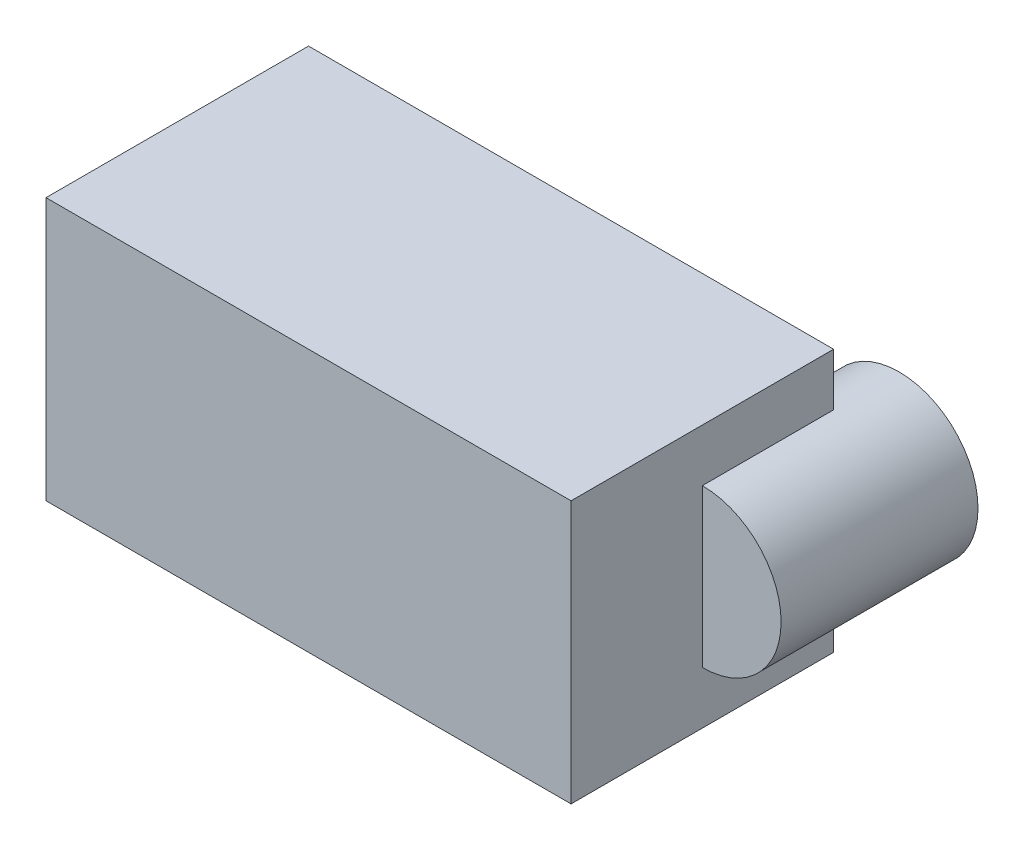
ISO-10303-21;
HEADER;
FILE_DESCRIPTION(('STEP AP214'),'2;1');
FILE_NAME('part.step','',(''),(''),'','','');
FILE_SCHEMA(('AUTOMOTIVE_DESIGN { 1 0 10303 214 1 1 1 1 }'));
ENDSEC;
DATA;
#1=APPLICATION_CONTEXT('core data for automotive mechanical design processes');
#2=APPLICATION_PROTOCOL_DEFINITION('international standard','automotive_design',2000,#1);
#3=PRODUCT_CONTEXT('',#1,'mechanical');
#4=PRODUCT('Part','Part','',(#3));
#5=PRODUCT_RELATED_PRODUCT_CATEGORY('part','',(#4));
#6=PRODUCT_DEFINITION_FORMATION('','',#4);
#7=PRODUCT_DEFINITION_CONTEXT('part definition',#1,'design');
#8=PRODUCT_DEFINITION('design','',#6,#7);
#9=PRODUCT_DEFINITION_SHAPE('','',#8);
#10=(LENGTH_UNIT() NAMED_UNIT(*) SI_UNIT(.MILLI.,.METRE.));
#11=(NAMED_UNIT(*) PLANE_ANGLE_UNIT() SI_UNIT($,.RADIAN.));
#12=(NAMED_UNIT(*) SI_UNIT($,.STERADIAN.) SOLID_ANGLE_UNIT());
#13=UNCERTAINTY_MEASURE_WITH_UNIT(LENGTH_MEASURE(1.E-05),#10,'distance_accuracy_value','');
#14=(GEOMETRIC_REPRESENTATION_CONTEXT(3) GLOBAL_UNCERTAINTY_ASSIGNED_CONTEXT((#13)) GLOBAL_UNIT_ASSIGNED_CONTEXT((#10,
#11,#12)) REPRESENTATION_CONTEXT('',''));
#15=CARTESIAN_POINT('',(0.,0.,0.));
#16=DIRECTION('',(0.,0.,1.));
#17=DIRECTION('',(1.,0.,0.));
#18=AXIS2_PLACEMENT_3D('',#15,#16,#17);
#19=CARTESIAN_POINT('',(0.,20.,10.));
#20=DIRECTION('',(1.,0.,0.));
#21=DIRECTION('',(0.,0.,-1.));
#22=AXIS2_PLACEMENT_3D('',#19,#20,#21);
#23=PLANE('',#22);
#24=DIRECTION('',(0.,-1.,0.));
#25=VECTOR('',#24,1.);
#26=CARTESIAN_POINT('',(0.,20.,-10.));
#27=LINE('',#26,#25);
#28=CARTESIAN_POINT('',(0.,20.,-10.));
#29=VERTEX_POINT('',#28);
#30=CARTESIAN_POINT('',(0.,0.,-10.));
#31=VERTEX_POINT('',#30);
#32=EDGE_CURVE('E118',#29,#31,#27,.T.);
#33=ORIENTED_EDGE('',*,*,#32,.T.);
#34=DIRECTION('',(0.,0.,-1.));
#35=VECTOR('',#34,1.);
#36=CARTESIAN_POINT('',(0.,0.,10.));
#37=LINE('',#36,#35);
#38=CARTESIAN_POINT('',(0.,0.,10.));
#39=VERTEX_POINT('',#38);
#40=EDGE_CURVE('E140',#39,#31,#37,.T.);
#41=ORIENTED_EDGE('',*,*,#40,.F.);
#42=DIRECTION('',(0.,-1.,0.));
#43=VECTOR('',#42,1.);
#44=CARTESIAN_POINT('',(0.,20.,10.));
#45=LINE('',#44,#43);
#46=CARTESIAN_POINT('',(0.,20.,10.));
#47=VERTEX_POINT('',#46);
#48=EDGE_CURVE('E124',#47,#39,#45,.T.);
#49=ORIENTED_EDGE('',*,*,#48,.F.);
#50=DIRECTION('',(0.,0.,-1.));
#51=VECTOR('',#50,1.);
#52=CARTESIAN_POINT('',(0.,20.,10.));
#53=LINE('',#52,#51);
#54=EDGE_CURVE('E129',#47,#29,#53,.T.);
#55=ORIENTED_EDGE('',*,*,#54,.T.);
#56=EDGE_LOOP('',(#33,#41,#49,#55));
#57=FACE_BOUND('',#56,.T.);
#58=ADVANCED_FACE('F41',(#57),#23,.F.);
#59=CARTESIAN_POINT('',(0.,0.,10.));
#60=DIRECTION('',(0.,1.,0.));
#61=DIRECTION('',(0.,0.,1.));
#62=AXIS2_PLACEMENT_3D('',#59,#60,#61);
#63=PLANE('',#62);
#64=DIRECTION('',(1.,0.,0.));
#65=VECTOR('',#64,1.);
#66=CARTESIAN_POINT('',(0.,0.,-10.));
#67=LINE('',#66,#65);
#68=CARTESIAN_POINT('',(40.,0.,-10.));
#69=VERTEX_POINT('',#68);
#70=EDGE_CURVE('E121',#31,#69,#67,.T.);
#71=ORIENTED_EDGE('',*,*,#70,.T.);
#72=DIRECTION('',(0.,0.,-1.));
#73=VECTOR('',#72,1.);
#74=CARTESIAN_POINT('',(40.,0.,10.));
#75=LINE('',#74,#73);
#76=CARTESIAN_POINT('',(40.,0.,10.));
#77=VERTEX_POINT('',#76);
#78=EDGE_CURVE('E138',#77,#69,#75,.T.);
#79=ORIENTED_EDGE('',*,*,#78,.F.);
#80=DIRECTION('',(1.,0.,0.));
#81=VECTOR('',#80,1.);
#82=CARTESIAN_POINT('',(0.,0.,10.));
#83=LINE('',#82,#81);
#84=EDGE_CURVE('E93',#39,#77,#83,.T.);
#85=ORIENTED_EDGE('',*,*,#84,.F.);
#86=ORIENTED_EDGE('',*,*,#40,.T.);
#87=EDGE_LOOP('',(#71,#79,#85,#86));
#88=FACE_BOUND('',#87,.T.);
#89=ADVANCED_FACE('F151',(#88),#63,.F.);
#90=CARTESIAN_POINT('',(40.,0.,10.));
#91=DIRECTION('',(-1.,0.,0.));
#92=DIRECTION('',(0.,0.,1.));
#93=AXIS2_PLACEMENT_3D('',#90,#91,#92);
#94=PLANE('',#93);
#95=DIRECTION('',(0.,1.,0.));
#96=VECTOR('',#95,1.);
#97=CARTESIAN_POINT('',(40.,0.,-10.));
#98=LINE('',#97,#96);
#99=CARTESIAN_POINT('',(40.,4.,-10.));
#100=VERTEX_POINT('',#99);
#101=EDGE_CURVE('E117',#69,#100,#98,.T.);
#102=ORIENTED_EDGE('',*,*,#101,.T.);
#103=DIRECTION('',(0.,0.,1.));
#104=VECTOR('',#103,1.);
#105=CARTESIAN_POINT('',(40.,4.,-15.));
#106=LINE('',#105,#104);
#107=CARTESIAN_POINT('',(40.,4.,0.));
#108=VERTEX_POINT('',#107);
#109=EDGE_CURVE('E55',#100,#108,#106,.T.);
#110=ORIENTED_EDGE('',*,*,#109,.T.);
#111=DIRECTION('',(0.,1.,0.));
#112=VECTOR('',#111,1.);
#113=CARTESIAN_POINT('',(40.,0.,0.));
#114=LINE('',#113,#112);
#115=CARTESIAN_POINT('',(40.,16.,0.));
#116=VERTEX_POINT('',#115);
#117=EDGE_CURVE('E11',#108,#116,#114,.T.);
#118=ORIENTED_EDGE('',*,*,#117,.T.);
#119=DIRECTION('',(0.,0.,1.));
#120=VECTOR('',#119,1.);
#121=CARTESIAN_POINT('',(40.,16.,-15.));
#122=LINE('',#121,#120);
#123=CARTESIAN_POINT('',(40.,16.,-10.));
#124=VERTEX_POINT('',#123);
#125=EDGE_CURVE('E102',#116,#124,#122,.F.);
#126=ORIENTED_EDGE('',*,*,#125,.T.);
#127=CARTESIAN_POINT('',(40.,20.,-10.));
#128=VERTEX_POINT('',#127);
#129=EDGE_CURVE('E132',#124,#128,#98,.T.);
#130=ORIENTED_EDGE('',*,*,#129,.T.);
#131=DIRECTION('',(0.,0.,-1.));
#132=VECTOR('',#131,1.);
#133=CARTESIAN_POINT('',(40.,20.,10.));
#134=LINE('',#133,#132);
#135=CARTESIAN_POINT('',(40.,20.,10.));
#136=VERTEX_POINT('',#135);
#137=EDGE_CURVE('E136',#136,#128,#134,.T.);
#138=ORIENTED_EDGE('',*,*,#137,.F.);
#139=DIRECTION('',(0.,1.,0.));
#140=VECTOR('',#139,1.);
#141=CARTESIAN_POINT('',(40.,0.,10.));
#142=LINE('',#141,#140);
#143=EDGE_CURVE('E127',#77,#136,#142,.T.);
#144=ORIENTED_EDGE('',*,*,#143,.F.);
#145=ORIENTED_EDGE('',*,*,#78,.T.);
#146=EDGE_LOOP('',(#102,#110,#118,#126,#130,#138,#144,#145));
#147=FACE_BOUND('',#146,.T.);
#148=ADVANCED_FACE('F114',(#147),#94,.F.);
#149=CARTESIAN_POINT('',(40.,20.,10.));
#150=DIRECTION('',(0.,-1.,0.));
#151=DIRECTION('',(0.,0.,-1.));
#152=AXIS2_PLACEMENT_3D('',#149,#150,#151);
#153=PLANE('',#152);
#154=DIRECTION('',(-1.,0.,0.));
#155=VECTOR('',#154,1.);
#156=CARTESIAN_POINT('',(40.,20.,-10.));
#157=LINE('',#156,#155);
#158=EDGE_CURVE('E85',#128,#29,#157,.T.);
#159=ORIENTED_EDGE('',*,*,#158,.T.);
#160=ORIENTED_EDGE('',*,*,#54,.F.);
#161=DIRECTION('',(-1.,0.,0.));
#162=VECTOR('',#161,1.);
#163=CARTESIAN_POINT('',(40.,20.,10.));
#164=LINE('',#163,#162);
#165=EDGE_CURVE('E64',#136,#47,#164,.T.);
#166=ORIENTED_EDGE('',*,*,#165,.F.);
#167=ORIENTED_EDGE('',*,*,#137,.T.);
#168=EDGE_LOOP('',(#159,#160,#166,#167));
#169=FACE_BOUND('',#168,.T.);
#170=ADVANCED_FACE('F146',(#169),#153,.F.);
#171=CARTESIAN_POINT('',(0.,0.,10.));
#172=DIRECTION('',(0.,0.,1.));
#173=DIRECTION('',(1.,0.,0.));
#174=AXIS2_PLACEMENT_3D('',#171,#172,#173);
#175=PLANE('',#174);
#176=ORIENTED_EDGE('',*,*,#48,.T.);
#177=ORIENTED_EDGE('',*,*,#84,.T.);
#178=ORIENTED_EDGE('',*,*,#143,.T.);
#179=ORIENTED_EDGE('',*,*,#165,.T.);
#180=EDGE_LOOP('',(#176,#177,#178,#179));
#181=FACE_BOUND('',#180,.T.);
#182=ADVANCED_FACE('F150',(#181),#175,.T.);
#183=CARTESIAN_POINT('',(0.,0.,-10.));
#184=DIRECTION('',(0.,0.,1.));
#185=DIRECTION('',(1.,0.,0.));
#186=AXIS2_PLACEMENT_3D('',#183,#184,#185);
#187=PLANE('',#186);
#188=ORIENTED_EDGE('',*,*,#129,.F.);
#189=CARTESIAN_POINT('',(40.,10.,-10.));
#190=DIRECTION('',(0.,0.,1.));
#191=DIRECTION('',(1.,0.,0.));
#192=AXIS2_PLACEMENT_3D('',#189,#190,#191);
#193=CIRCLE('',#192,6.);
#194=EDGE_CURVE('E48',#124,#100,#193,.T.);
#195=ORIENTED_EDGE('',*,*,#194,.T.);
#196=ORIENTED_EDGE('',*,*,#101,.F.);
#197=ORIENTED_EDGE('',*,*,#70,.F.);
#198=ORIENTED_EDGE('',*,*,#32,.F.);
#199=ORIENTED_EDGE('',*,*,#158,.F.);
#200=EDGE_LOOP('',(#188,#195,#196,#197,#198,#199));
#201=FACE_BOUND('',#200,.T.);
#202=ADVANCED_FACE('F142',(#201),#187,.F.);
#203=CARTESIAN_POINT('',(40.,10.,0.));
#204=DIRECTION('',(0.,0.,1.));
#205=DIRECTION('',(1.,0.,0.));
#206=AXIS2_PLACEMENT_3D('',#203,#204,#205);
#207=PLANE('',#206);
#208=ORIENTED_EDGE('',*,*,#117,.F.);
#209=CARTESIAN_POINT('',(40.,10.,0.));
#210=DIRECTION('',(0.,0.,1.));
#211=DIRECTION('',(1.,0.,0.));
#212=AXIS2_PLACEMENT_3D('',#209,#210,#211);
#213=CIRCLE('',#212,6.);
#214=EDGE_CURVE('E105',#108,#116,#213,.T.);
#215=ORIENTED_EDGE('',*,*,#214,.T.);
#216=EDGE_LOOP('',(#208,#215));
#217=FACE_BOUND('',#216,.T.);
#218=ADVANCED_FACE('F111',(#217),#207,.T.);
#219=CARTESIAN_POINT('',(40.,10.,-15.));
#220=DIRECTION('',(0.,0.,1.));
#221=DIRECTION('',(1.,0.,0.));
#222=AXIS2_PLACEMENT_3D('',#219,#220,#221);
#223=CYLINDRICAL_SURFACE('',#222,6.);
#224=CARTESIAN_POINT('',(40.,10.,-15.));
#225=DIRECTION('',(0.,0.,1.));
#226=DIRECTION('',(1.,0.,0.));
#227=AXIS2_PLACEMENT_3D('',#224,#225,#226);
#228=CIRCLE('',#227,6.);
#229=CARTESIAN_POINT('',(46.,10.,-15.));
#230=VERTEX_POINT('',#229);
#231=EDGE_CURVE('E108',#230,#230,#228,.T.);
#232=ORIENTED_EDGE('',*,*,#231,.T.);
#233=EDGE_LOOP('',(#232));
#234=FACE_BOUND('',#233,.T.);
#235=ORIENTED_EDGE('',*,*,#109,.F.);
#236=ORIENTED_EDGE('',*,*,#194,.F.);
#237=ORIENTED_EDGE('',*,*,#125,.F.);
#238=ORIENTED_EDGE('',*,*,#214,.F.);
#239=EDGE_LOOP('',(#235,#236,#237,#238));
#240=FACE_BOUND('',#239,.T.);
#241=ADVANCED_FACE('F104',(#234,#240),#223,.T.);
#242=CARTESIAN_POINT('',(40.,10.,-15.));
#243=DIRECTION('',(0.,0.,1.));
#244=DIRECTION('',(1.,0.,0.));
#245=AXIS2_PLACEMENT_3D('',#242,#243,#244);
#246=PLANE('',#245);
#247=ORIENTED_EDGE('',*,*,#231,.F.);
#248=EDGE_LOOP('',(#247));
#249=FACE_BOUND('',#248,.T.);
#250=ADVANCED_FACE('F167',(#249),#246,.F.);
#251=CLOSED_SHELL('',(#58,#89,#148,#170,#182,#202,#218,#241,#250));
#252=MANIFOLD_SOLID_BREP('B2',#251);
#253=ADVANCED_BREP_SHAPE_REPRESENTATION('',(#18,#252),#14);
#254=SHAPE_DEFINITION_REPRESENTATION(#9,#253);
ENDSEC;
END-ISO-10303-21;
